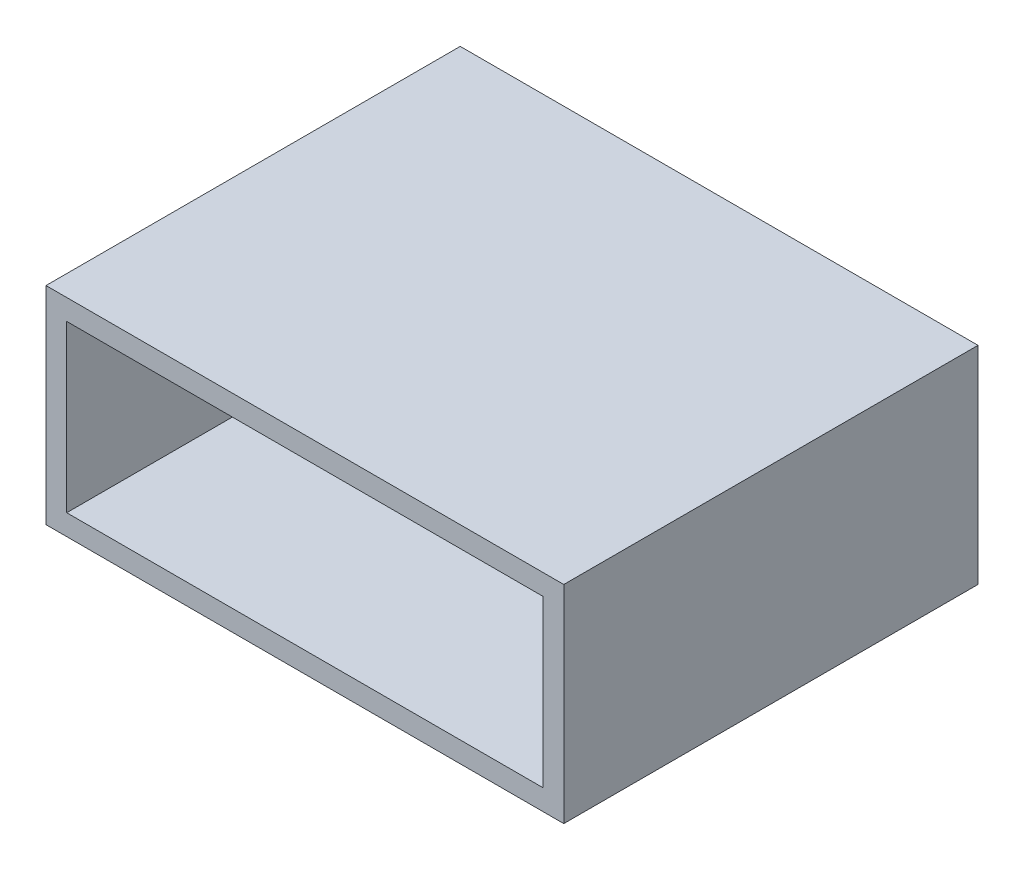
ISO-10303-21;
HEADER;
FILE_DESCRIPTION(('STEP AP214'),'2;1');
FILE_NAME('part.step','',(''),(''),'','','');
FILE_SCHEMA(('AUTOMOTIVE_DESIGN { 1 0 10303 214 1 1 1 1 }'));
ENDSEC;
DATA;
#1=APPLICATION_CONTEXT('core data for automotive mechanical design processes');
#2=APPLICATION_PROTOCOL_DEFINITION('international standard','automotive_design',2000,#1);
#3=PRODUCT_CONTEXT('',#1,'mechanical');
#4=PRODUCT('Part','Part','',(#3));
#5=PRODUCT_RELATED_PRODUCT_CATEGORY('part','',(#4));
#6=PRODUCT_DEFINITION_FORMATION('','',#4);
#7=PRODUCT_DEFINITION_CONTEXT('part definition',#1,'design');
#8=PRODUCT_DEFINITION('design','',#6,#7);
#9=PRODUCT_DEFINITION_SHAPE('','',#8);
#10=(LENGTH_UNIT() NAMED_UNIT(*) SI_UNIT(.MILLI.,.METRE.));
#11=(NAMED_UNIT(*) PLANE_ANGLE_UNIT() SI_UNIT($,.RADIAN.));
#12=(NAMED_UNIT(*) SI_UNIT($,.STERADIAN.) SOLID_ANGLE_UNIT());
#13=UNCERTAINTY_MEASURE_WITH_UNIT(LENGTH_MEASURE(1.E-05),#10,'distance_accuracy_value','');
#14=(GEOMETRIC_REPRESENTATION_CONTEXT(3) GLOBAL_UNCERTAINTY_ASSIGNED_CONTEXT((#13)) GLOBAL_UNIT_ASSIGNED_CONTEXT((#10,
#11,#12)) REPRESENTATION_CONTEXT('',''));
#15=CARTESIAN_POINT('',(0.,0.,0.));
#16=DIRECTION('',(0.,0.,1.));
#17=DIRECTION('',(1.,0.,0.));
#18=AXIS2_PLACEMENT_3D('',#15,#16,#17);
#19=CARTESIAN_POINT('',(0.,0.,101.6));
#20=DIRECTION('',(1.,0.,0.));
#21=DIRECTION('',(0.,0.,-1.));
#22=AXIS2_PLACEMENT_3D('',#19,#20,#21);
#23=PLANE('',#22);
#24=DIRECTION('',(0.,-1.,0.));
#25=VECTOR('',#24,1.);
#26=CARTESIAN_POINT('',(0.,0.,0.));
#27=LINE('',#26,#25);
#28=CARTESIAN_POINT('',(0.,0.,0.));
#29=VERTEX_POINT('',#28);
#30=CARTESIAN_POINT('',(0.,-50.8,0.));
#31=VERTEX_POINT('',#30);
#32=EDGE_CURVE('E117',#29,#31,#27,.T.);
#33=ORIENTED_EDGE('',*,*,#32,.T.);
#34=DIRECTION('',(0.,0.,-1.));
#35=VECTOR('',#34,1.);
#36=CARTESIAN_POINT('',(0.,-50.8,101.6));
#37=LINE('',#36,#35);
#38=CARTESIAN_POINT('',(0.,-50.8,101.6));
#39=VERTEX_POINT('',#38);
#40=EDGE_CURVE('E11',#39,#31,#37,.T.);
#41=ORIENTED_EDGE('',*,*,#40,.F.);
#42=DIRECTION('',(0.,-1.,0.));
#43=VECTOR('',#42,1.);
#44=CARTESIAN_POINT('',(0.,0.,101.6));
#45=LINE('',#44,#43);
#46=CARTESIAN_POINT('',(0.,0.,101.6));
#47=VERTEX_POINT('',#46);
#48=EDGE_CURVE('E156',#47,#39,#45,.T.);
#49=ORIENTED_EDGE('',*,*,#48,.F.);
#50=DIRECTION('',(0.,0.,-1.));
#51=VECTOR('',#50,1.);
#52=CARTESIAN_POINT('',(0.,0.,101.6));
#53=LINE('',#52,#51);
#54=EDGE_CURVE('E170',#47,#29,#53,.T.);
#55=ORIENTED_EDGE('',*,*,#54,.T.);
#56=EDGE_LOOP('',(#33,#41,#49,#55));
#57=FACE_BOUND('',#56,.T.);
#58=ADVANCED_FACE('F45',(#57),#23,.F.);
#59=CARTESIAN_POINT('',(0.,-50.8,101.6));
#60=DIRECTION('',(0.,1.,0.));
#61=DIRECTION('',(0.,0.,1.));
#62=AXIS2_PLACEMENT_3D('',#59,#60,#61);
#63=PLANE('',#62);
#64=DIRECTION('',(1.,0.,0.));
#65=VECTOR('',#64,1.);
#66=CARTESIAN_POINT('',(0.,-50.8,0.));
#67=LINE('',#66,#65);
#68=CARTESIAN_POINT('',(127.,-50.8,0.));
#69=VERTEX_POINT('',#68);
#70=EDGE_CURVE('E174',#31,#69,#67,.T.);
#71=ORIENTED_EDGE('',*,*,#70,.T.);
#72=DIRECTION('',(0.,0.,-1.));
#73=VECTOR('',#72,1.);
#74=CARTESIAN_POINT('',(127.,-50.8,101.6));
#75=LINE('',#74,#73);
#76=CARTESIAN_POINT('',(127.,-50.8,101.6));
#77=VERTEX_POINT('',#76);
#78=EDGE_CURVE('E53',#77,#69,#75,.T.);
#79=ORIENTED_EDGE('',*,*,#78,.F.);
#80=DIRECTION('',(1.,0.,0.));
#81=VECTOR('',#80,1.);
#82=CARTESIAN_POINT('',(0.,-50.8,101.6));
#83=LINE('',#82,#81);
#84=EDGE_CURVE('E160',#39,#77,#83,.T.);
#85=ORIENTED_EDGE('',*,*,#84,.F.);
#86=ORIENTED_EDGE('',*,*,#40,.T.);
#87=EDGE_LOOP('',(#71,#79,#85,#86));
#88=FACE_BOUND('',#87,.T.);
#89=ADVANCED_FACE('F208',(#88),#63,.F.);
#90=CARTESIAN_POINT('',(127.,0.,101.6));
#91=DIRECTION('',(-1.,0.,0.));
#92=DIRECTION('',(0.,0.,1.));
#93=AXIS2_PLACEMENT_3D('',#90,#91,#92);
#94=PLANE('',#93);
#95=DIRECTION('',(0.,1.,0.));
#96=VECTOR('',#95,1.);
#97=CARTESIAN_POINT('',(127.,0.,0.));
#98=LINE('',#97,#96);
#99=CARTESIAN_POINT('',(127.,0.,0.));
#100=VERTEX_POINT('',#99);
#101=EDGE_CURVE('E177',#69,#100,#98,.T.);
#102=ORIENTED_EDGE('',*,*,#101,.T.);
#103=DIRECTION('',(0.,0.,-1.));
#104=VECTOR('',#103,1.);
#105=CARTESIAN_POINT('',(127.,0.,101.6));
#106=LINE('',#105,#104);
#107=CARTESIAN_POINT('',(127.,0.,101.6));
#108=VERTEX_POINT('',#107);
#109=EDGE_CURVE('E185',#108,#100,#106,.T.);
#110=ORIENTED_EDGE('',*,*,#109,.F.);
#111=DIRECTION('',(0.,1.,0.));
#112=VECTOR('',#111,1.);
#113=CARTESIAN_POINT('',(127.,0.,101.6));
#114=LINE('',#113,#112);
#115=EDGE_CURVE('E164',#77,#108,#114,.T.);
#116=ORIENTED_EDGE('',*,*,#115,.F.);
#117=ORIENTED_EDGE('',*,*,#78,.T.);
#118=EDGE_LOOP('',(#102,#110,#116,#117));
#119=FACE_BOUND('',#118,.T.);
#120=ADVANCED_FACE('F194',(#119),#94,.F.);
#121=CARTESIAN_POINT('',(0.,0.,101.6));
#122=DIRECTION('',(0.,-1.,0.));
#123=DIRECTION('',(0.,0.,-1.));
#124=AXIS2_PLACEMENT_3D('',#121,#122,#123);
#125=PLANE('',#124);
#126=DIRECTION('',(-1.,0.,0.));
#127=VECTOR('',#126,1.);
#128=CARTESIAN_POINT('',(0.,0.,0.));
#129=LINE('',#128,#127);
#130=EDGE_CURVE('E161',#100,#29,#129,.T.);
#131=ORIENTED_EDGE('',*,*,#130,.T.);
#132=ORIENTED_EDGE('',*,*,#54,.F.);
#133=DIRECTION('',(-1.,0.,0.));
#134=VECTOR('',#133,1.);
#135=CARTESIAN_POINT('',(0.,0.,101.6));
#136=LINE('',#135,#134);
#137=EDGE_CURVE('E167',#108,#47,#136,.T.);
#138=ORIENTED_EDGE('',*,*,#137,.F.);
#139=ORIENTED_EDGE('',*,*,#109,.T.);
#140=EDGE_LOOP('',(#131,#132,#138,#139));
#141=FACE_BOUND('',#140,.T.);
#142=ADVANCED_FACE('F203',(#141),#125,.F.);
#143=CARTESIAN_POINT('',(0.,0.,101.6));
#144=DIRECTION('',(0.,0.,1.));
#145=DIRECTION('',(1.,0.,0.));
#146=AXIS2_PLACEMENT_3D('',#143,#144,#145);
#147=PLANE('',#146);
#148=DIRECTION('',(0.,-1.,0.));
#149=VECTOR('',#148,1.);
#150=CARTESIAN_POINT('',(121.92,-5.08,101.6));
#151=LINE('',#150,#149);
#152=CARTESIAN_POINT('',(121.92,-5.08,101.6));
#153=VERTEX_POINT('',#152);
#154=CARTESIAN_POINT('',(121.92,-45.72,101.6));
#155=VERTEX_POINT('',#154);
#156=EDGE_CURVE('E121',#153,#155,#151,.T.);
#157=ORIENTED_EDGE('',*,*,#156,.T.);
#158=DIRECTION('',(-1.,0.,0.));
#159=VECTOR('',#158,1.);
#160=CARTESIAN_POINT('',(121.92,-45.72,101.6));
#161=LINE('',#160,#159);
#162=CARTESIAN_POINT('',(5.08,-45.72,101.6));
#163=VERTEX_POINT('',#162);
#164=EDGE_CURVE('E109',#155,#163,#161,.T.);
#165=ORIENTED_EDGE('',*,*,#164,.T.);
#166=DIRECTION('',(0.,1.,0.));
#167=VECTOR('',#166,1.);
#168=CARTESIAN_POINT('',(5.08,-5.08,101.6));
#169=LINE('',#168,#167);
#170=CARTESIAN_POINT('',(5.08,-5.08,101.6));
#171=VERTEX_POINT('',#170);
#172=EDGE_CURVE('E136',#163,#171,#169,.T.);
#173=ORIENTED_EDGE('',*,*,#172,.T.);
#174=DIRECTION('',(1.,0.,0.));
#175=VECTOR('',#174,1.);
#176=CARTESIAN_POINT('',(121.92,-5.08,101.6));
#177=LINE('',#176,#175);
#178=EDGE_CURVE('E129',#171,#153,#177,.T.);
#179=ORIENTED_EDGE('',*,*,#178,.T.);
#180=EDGE_LOOP('',(#157,#165,#173,#179));
#181=FACE_BOUND('',#180,.T.);
#182=ORIENTED_EDGE('',*,*,#48,.T.);
#183=ORIENTED_EDGE('',*,*,#84,.T.);
#184=ORIENTED_EDGE('',*,*,#115,.T.);
#185=ORIENTED_EDGE('',*,*,#137,.T.);
#186=EDGE_LOOP('',(#182,#183,#184,#185));
#187=FACE_BOUND('',#186,.T.);
#188=ADVANCED_FACE('F127',(#181,#187),#147,.T.);
#189=CARTESIAN_POINT('',(0.,0.,0.));
#190=DIRECTION('',(0.,0.,1.));
#191=DIRECTION('',(1.,0.,0.));
#192=AXIS2_PLACEMENT_3D('',#189,#190,#191);
#193=PLANE('',#192);
#194=DIRECTION('',(-1.,0.,0.));
#195=VECTOR('',#194,1.);
#196=CARTESIAN_POINT('',(121.92,-45.72,0.));
#197=LINE('',#196,#195);
#198=CARTESIAN_POINT('',(121.92,-45.72,0.));
#199=VERTEX_POINT('',#198);
#200=CARTESIAN_POINT('',(5.08,-45.72,0.));
#201=VERTEX_POINT('',#200);
#202=EDGE_CURVE('E134',#199,#201,#197,.T.);
#203=ORIENTED_EDGE('',*,*,#202,.F.);
#204=DIRECTION('',(0.,-1.,0.));
#205=VECTOR('',#204,1.);
#206=CARTESIAN_POINT('',(121.92,-5.08,0.));
#207=LINE('',#206,#205);
#208=CARTESIAN_POINT('',(121.92,-5.08,0.));
#209=VERTEX_POINT('',#208);
#210=EDGE_CURVE('E68',#209,#199,#207,.T.);
#211=ORIENTED_EDGE('',*,*,#210,.F.);
#212=DIRECTION('',(1.,0.,0.));
#213=VECTOR('',#212,1.);
#214=CARTESIAN_POINT('',(121.92,-5.08,0.));
#215=LINE('',#214,#213);
#216=CARTESIAN_POINT('',(5.08,-5.08,0.));
#217=VERTEX_POINT('',#216);
#218=EDGE_CURVE('E124',#217,#209,#215,.T.);
#219=ORIENTED_EDGE('',*,*,#218,.F.);
#220=DIRECTION('',(0.,1.,0.));
#221=VECTOR('',#220,1.);
#222=CARTESIAN_POINT('',(5.08,-5.08,0.));
#223=LINE('',#222,#221);
#224=EDGE_CURVE('E142',#201,#217,#223,.T.);
#225=ORIENTED_EDGE('',*,*,#224,.F.);
#226=EDGE_LOOP('',(#203,#211,#219,#225));
#227=FACE_BOUND('',#226,.T.);
#228=ORIENTED_EDGE('',*,*,#32,.F.);
#229=ORIENTED_EDGE('',*,*,#130,.F.);
#230=ORIENTED_EDGE('',*,*,#101,.F.);
#231=ORIENTED_EDGE('',*,*,#70,.F.);
#232=EDGE_LOOP('',(#228,#229,#230,#231));
#233=FACE_BOUND('',#232,.T.);
#234=ADVANCED_FACE('F200',(#227,#233),#193,.F.);
#235=CARTESIAN_POINT('',(121.92,-5.08,101.601));
#236=DIRECTION('',(1.,0.,0.));
#237=DIRECTION('',(0.,0.,-1.));
#238=AXIS2_PLACEMENT_3D('',#235,#236,#237);
#239=PLANE('',#238);
#240=DIRECTION('',(0.,0.,-1.));
#241=VECTOR('',#240,1.);
#242=CARTESIAN_POINT('',(121.92,-5.08,101.601));
#243=LINE('',#242,#241);
#244=EDGE_CURVE('E118',#153,#209,#243,.T.);
#245=ORIENTED_EDGE('',*,*,#244,.T.);
#246=ORIENTED_EDGE('',*,*,#210,.T.);
#247=DIRECTION('',(0.,0.,-1.));
#248=VECTOR('',#247,1.);
#249=CARTESIAN_POINT('',(121.92,-45.72,101.601));
#250=LINE('',#249,#248);
#251=EDGE_CURVE('E111',#155,#199,#250,.T.);
#252=ORIENTED_EDGE('',*,*,#251,.F.);
#253=ORIENTED_EDGE('',*,*,#156,.F.);
#254=EDGE_LOOP('',(#245,#246,#252,#253));
#255=FACE_BOUND('',#254,.T.);
#256=ADVANCED_FACE('F120',(#255),#239,.F.);
#257=CARTESIAN_POINT('',(121.92,-5.08,101.601));
#258=DIRECTION('',(0.,1.,0.));
#259=DIRECTION('',(0.,0.,1.));
#260=AXIS2_PLACEMENT_3D('',#257,#258,#259);
#261=PLANE('',#260);
#262=DIRECTION('',(0.,0.,-1.));
#263=VECTOR('',#262,1.);
#264=CARTESIAN_POINT('',(5.08,-5.08,101.601));
#265=LINE('',#264,#263);
#266=EDGE_CURVE('E151',#171,#217,#265,.T.);
#267=ORIENTED_EDGE('',*,*,#266,.T.);
#268=ORIENTED_EDGE('',*,*,#218,.T.);
#269=ORIENTED_EDGE('',*,*,#244,.F.);
#270=ORIENTED_EDGE('',*,*,#178,.F.);
#271=EDGE_LOOP('',(#267,#268,#269,#270));
#272=FACE_BOUND('',#271,.T.);
#273=ADVANCED_FACE('F225',(#272),#261,.F.);
#274=CARTESIAN_POINT('',(5.08,-5.08,101.601));
#275=DIRECTION('',(-1.,0.,0.));
#276=DIRECTION('',(0.,0.,1.));
#277=AXIS2_PLACEMENT_3D('',#274,#275,#276);
#278=PLANE('',#277);
#279=DIRECTION('',(0.,0.,-1.));
#280=VECTOR('',#279,1.);
#281=CARTESIAN_POINT('',(5.08,-45.72,101.601));
#282=LINE('',#281,#280);
#283=EDGE_CURVE('E60',#163,#201,#282,.T.);
#284=ORIENTED_EDGE('',*,*,#283,.T.);
#285=ORIENTED_EDGE('',*,*,#224,.T.);
#286=ORIENTED_EDGE('',*,*,#266,.F.);
#287=ORIENTED_EDGE('',*,*,#172,.F.);
#288=EDGE_LOOP('',(#284,#285,#286,#287));
#289=FACE_BOUND('',#288,.T.);
#290=ADVANCED_FACE('F228',(#289),#278,.F.);
#291=CARTESIAN_POINT('',(121.92,-45.72,101.601));
#292=DIRECTION('',(0.,-1.,0.));
#293=DIRECTION('',(0.,0.,-1.));
#294=AXIS2_PLACEMENT_3D('',#291,#292,#293);
#295=PLANE('',#294);
#296=ORIENTED_EDGE('',*,*,#251,.T.);
#297=ORIENTED_EDGE('',*,*,#202,.T.);
#298=ORIENTED_EDGE('',*,*,#283,.F.);
#299=ORIENTED_EDGE('',*,*,#164,.F.);
#300=EDGE_LOOP('',(#296,#297,#298,#299));
#301=FACE_BOUND('',#300,.T.);
#302=ADVANCED_FACE('F110',(#301),#295,.F.);
#303=CLOSED_SHELL('',(#58,#89,#120,#142,#188,#234,#256,#273,#290,#302));
#304=MANIFOLD_SOLID_BREP('B2',#303);
#305=ADVANCED_BREP_SHAPE_REPRESENTATION('',(#18,#304),#14);
#306=SHAPE_DEFINITION_REPRESENTATION(#9,#305);
ENDSEC;
END-ISO-10303-21;
